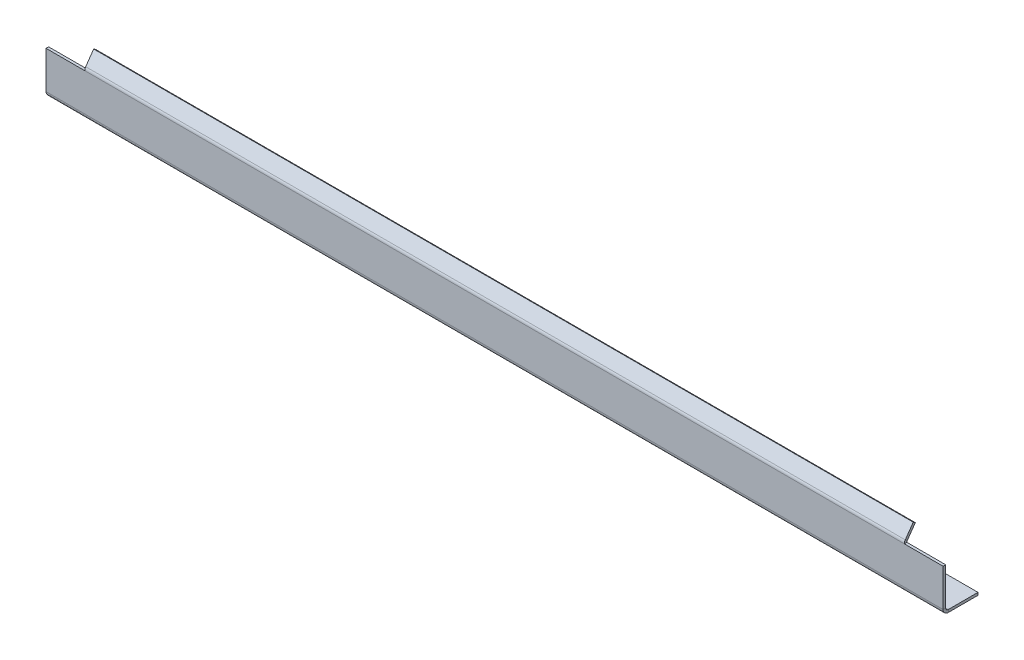
ISO-10303-21;
HEADER;
FILE_DESCRIPTION(('STEP AP214'),'2;1');
FILE_NAME('part.step','',(''),(''),'','','');
FILE_SCHEMA(('AUTOMOTIVE_DESIGN { 1 0 10303 214 1 1 1 1 }'));
ENDSEC;
DATA;
#1=APPLICATION_CONTEXT('core data for automotive mechanical design processes');
#2=APPLICATION_PROTOCOL_DEFINITION('international standard','automotive_design',2000,#1);
#3=PRODUCT_CONTEXT('',#1,'mechanical');
#4=PRODUCT('Part','Part','',(#3));
#5=PRODUCT_RELATED_PRODUCT_CATEGORY('part','',(#4));
#6=PRODUCT_DEFINITION_FORMATION('','',#4);
#7=PRODUCT_DEFINITION_CONTEXT('part definition',#1,'design');
#8=PRODUCT_DEFINITION('design','',#6,#7);
#9=PRODUCT_DEFINITION_SHAPE('','',#8);
#10=(LENGTH_UNIT() NAMED_UNIT(*) SI_UNIT(.MILLI.,.METRE.));
#11=(NAMED_UNIT(*) PLANE_ANGLE_UNIT() SI_UNIT($,.RADIAN.));
#12=(NAMED_UNIT(*) SI_UNIT($,.STERADIAN.) SOLID_ANGLE_UNIT());
#13=UNCERTAINTY_MEASURE_WITH_UNIT(LENGTH_MEASURE(1.E-05),#10,'distance_accuracy_value','');
#14=(GEOMETRIC_REPRESENTATION_CONTEXT(3) GLOBAL_UNCERTAINTY_ASSIGNED_CONTEXT((#13)) GLOBAL_UNIT_ASSIGNED_CONTEXT((#10,
#11,#12)) REPRESENTATION_CONTEXT('',''));
#15=CARTESIAN_POINT('',(0.,0.,0.));
#16=DIRECTION('',(0.,0.,1.));
#17=DIRECTION('',(1.,0.,0.));
#18=AXIS2_PLACEMENT_3D('',#15,#16,#17);
#19=CARTESIAN_POINT('',(-347.,16.5,2.));
#20=DIRECTION('',(0.,-1.,0.));
#21=DIRECTION('',(0.,0.,-1.));
#22=AXIS2_PLACEMENT_3D('',#19,#20,#21);
#23=PLANE('',#22);
#24=DIRECTION('',(0.,0.,1.));
#25=VECTOR('',#24,1.);
#26=CARTESIAN_POINT('',(-317.,16.4999999999999,0.));
#27=LINE('',#26,#25);
#28=CARTESIAN_POINT('',(-317.,16.4999999999999,0.));
#29=VERTEX_POINT('',#28);
#30=CARTESIAN_POINT('',(-317.,16.4999999999999,2.00000000000003));
#31=VERTEX_POINT('',#30);
#32=EDGE_CURVE('E241',#29,#31,#27,.T.);
#33=ORIENTED_EDGE('',*,*,#32,.F.);
#34=DIRECTION('',(-1.,0.,0.));
#35=VECTOR('',#34,1.);
#36=CARTESIAN_POINT('',(-347.,16.5,0.));
#37=LINE('',#36,#35);
#38=CARTESIAN_POINT('',(-347.,16.5,0.));
#39=VERTEX_POINT('',#38);
#40=EDGE_CURVE('E312',#29,#39,#37,.T.);
#41=ORIENTED_EDGE('',*,*,#40,.T.);
#42=DIRECTION('',(0.,0.,-1.));
#43=VECTOR('',#42,1.);
#44=CARTESIAN_POINT('',(-347.,16.5,2.));
#45=LINE('',#44,#43);
#46=CARTESIAN_POINT('',(-347.,16.5,2.));
#47=VERTEX_POINT('',#46);
#48=EDGE_CURVE('E88',#47,#39,#45,.T.);
#49=ORIENTED_EDGE('',*,*,#48,.F.);
#50=DIRECTION('',(-1.,0.,0.));
#51=VECTOR('',#50,1.);
#52=CARTESIAN_POINT('',(-347.,16.5,2.));
#53=LINE('',#52,#51);
#54=EDGE_CURVE('E302',#31,#47,#53,.T.);
#55=ORIENTED_EDGE('',*,*,#54,.F.);
#56=EDGE_LOOP('',(#33,#41,#49,#55));
#57=FACE_BOUND('',#56,.T.);
#58=ADVANCED_FACE('F80',(#57),#23,.F.);
#59=CARTESIAN_POINT('',(347.,16.5,2.));
#60=DIRECTION('',(-1.,0.,0.));
#61=DIRECTION('',(0.,0.,1.));
#62=AXIS2_PLACEMENT_3D('',#59,#60,#61);
#63=PLANE('',#62);
#64=DIRECTION('',(0.,0.,1.));
#65=VECTOR('',#64,1.);
#66=CARTESIAN_POINT('',(347.,-12.5,1.23165366794353E-13));
#67=LINE('',#66,#65);
#68=CARTESIAN_POINT('',(347.,-12.5,1.23165366794353E-13));
#69=VERTEX_POINT('',#68);
#70=CARTESIAN_POINT('',(347.,-12.5,2.));
#71=VERTEX_POINT('',#70);
#72=EDGE_CURVE('E295',#69,#71,#67,.T.);
#73=ORIENTED_EDGE('',*,*,#72,.F.);
#74=DIRECTION('',(0.,1.,0.));
#75=VECTOR('',#74,1.);
#76=CARTESIAN_POINT('',(347.,16.5,0.));
#77=LINE('',#76,#75);
#78=CARTESIAN_POINT('',(347.,16.5,0.));
#79=VERTEX_POINT('',#78);
#80=EDGE_CURVE('E297',#69,#79,#77,.T.);
#81=ORIENTED_EDGE('',*,*,#80,.T.);
#82=DIRECTION('',(0.,0.,-1.));
#83=VECTOR('',#82,1.);
#84=CARTESIAN_POINT('',(347.,16.5,2.));
#85=LINE('',#84,#83);
#86=CARTESIAN_POINT('',(347.,16.5,2.));
#87=VERTEX_POINT('',#86);
#88=EDGE_CURVE('E13',#87,#79,#85,.T.);
#89=ORIENTED_EDGE('',*,*,#88,.F.);
#90=DIRECTION('',(0.,1.,0.));
#91=VECTOR('',#90,1.);
#92=CARTESIAN_POINT('',(347.,16.5,2.));
#93=LINE('',#92,#91);
#94=EDGE_CURVE('E300',#71,#87,#93,.T.);
#95=ORIENTED_EDGE('',*,*,#94,.F.);
#96=EDGE_LOOP('',(#73,#81,#89,#95));
#97=FACE_BOUND('',#96,.T.);
#98=ADVANCED_FACE('F82',(#97),#63,.F.);
#99=CARTESIAN_POINT('',(-347.,16.5,2.));
#100=DIRECTION('',(1.,0.,0.));
#101=DIRECTION('',(0.,0.,-1.));
#102=AXIS2_PLACEMENT_3D('',#99,#100,#101);
#103=PLANE('',#102);
#104=DIRECTION('',(0.,0.,1.));
#105=VECTOR('',#104,1.);
#106=CARTESIAN_POINT('',(-347.,-12.5,1.23165366794353E-13));
#107=LINE('',#106,#105);
#108=CARTESIAN_POINT('',(-347.,-12.5,1.23165366794353E-13));
#109=VERTEX_POINT('',#108);
#110=CARTESIAN_POINT('',(-347.,-12.5,2.00000000000012));
#111=VERTEX_POINT('',#110);
#112=EDGE_CURVE('E285',#109,#111,#107,.T.);
#113=ORIENTED_EDGE('',*,*,#112,.T.);
#114=DIRECTION('',(0.,-1.,0.));
#115=VECTOR('',#114,1.);
#116=CARTESIAN_POINT('',(-347.,16.5,2.));
#117=LINE('',#116,#115);
#118=EDGE_CURVE('E307',#47,#111,#117,.T.);
#119=ORIENTED_EDGE('',*,*,#118,.F.);
#120=ORIENTED_EDGE('',*,*,#48,.T.);
#121=DIRECTION('',(0.,-1.,0.));
#122=VECTOR('',#121,1.);
#123=CARTESIAN_POINT('',(-347.,16.5,0.));
#124=LINE('',#123,#122);
#125=EDGE_CURVE('E303',#39,#109,#124,.T.);
#126=ORIENTED_EDGE('',*,*,#125,.T.);
#127=EDGE_LOOP('',(#113,#119,#120,#126));
#128=FACE_BOUND('',#127,.T.);
#129=ADVANCED_FACE('F323',(#128),#103,.F.);
#130=CARTESIAN_POINT('',(347.,-16.5,2.));
#131=DIRECTION('',(0.,0.,1.));
#132=DIRECTION('',(1.,0.,0.));
#133=AXIS2_PLACEMENT_3D('',#130,#131,#132);
#134=PLANE('',#133);
#135=ORIENTED_EDGE('',*,*,#118,.T.);
#136=DIRECTION('',(-1.,0.,0.));
#137=VECTOR('',#136,1.);
#138=CARTESIAN_POINT('',(-347.,-12.5,2.00000000000012));
#139=LINE('',#138,#137);
#140=EDGE_CURVE('E280',#111,#71,#139,.F.);
#141=ORIENTED_EDGE('',*,*,#140,.T.);
#142=ORIENTED_EDGE('',*,*,#94,.T.);
#143=CARTESIAN_POINT('',(317.,16.5,2.));
#144=VERTEX_POINT('',#143);
#145=EDGE_CURVE('E304',#87,#144,#53,.T.);
#146=ORIENTED_EDGE('',*,*,#145,.T.);
#147=DIRECTION('',(1.,0.,0.));
#148=VECTOR('',#147,1.);
#149=CARTESIAN_POINT('',(317.,16.4999999999999,2.00000000000037));
#150=LINE('',#149,#148);
#151=EDGE_CURVE('E185',#144,#31,#150,.F.);
#152=ORIENTED_EDGE('',*,*,#151,.T.);
#153=ORIENTED_EDGE('',*,*,#54,.T.);
#154=EDGE_LOOP('',(#135,#141,#142,#146,#152,#153));
#155=FACE_BOUND('',#154,.T.);
#156=ADVANCED_FACE('F362',(#155),#134,.T.);
#157=CARTESIAN_POINT('',(347.,-16.5,0.));
#158=DIRECTION('',(0.,0.,1.));
#159=DIRECTION('',(1.,0.,0.));
#160=AXIS2_PLACEMENT_3D('',#157,#158,#159);
#161=PLANE('',#160);
#162=DIRECTION('',(-1.,0.,0.));
#163=VECTOR('',#162,1.);
#164=CARTESIAN_POINT('',(-347.,-12.5,1.23165366794353E-13));
#165=LINE('',#164,#163);
#166=EDGE_CURVE('E291',#109,#69,#165,.F.);
#167=ORIENTED_EDGE('',*,*,#166,.F.);
#168=ORIENTED_EDGE('',*,*,#125,.F.);
#169=ORIENTED_EDGE('',*,*,#40,.F.);
#170=DIRECTION('',(1.,0.,0.));
#171=VECTOR('',#170,1.);
#172=CARTESIAN_POINT('',(317.,16.4999999999999,3.68195057776077E-13));
#173=LINE('',#172,#171);
#174=CARTESIAN_POINT('',(317.,16.4999999999999,3.68195057776077E-13));
#175=VERTEX_POINT('',#174);
#176=EDGE_CURVE('E238',#175,#29,#173,.F.);
#177=ORIENTED_EDGE('',*,*,#176,.F.);
#178=EDGE_CURVE('E313',#79,#175,#37,.T.);
#179=ORIENTED_EDGE('',*,*,#178,.F.);
#180=ORIENTED_EDGE('',*,*,#80,.F.);
#181=EDGE_LOOP('',(#167,#168,#169,#177,#179,#180));
#182=FACE_BOUND('',#181,.T.);
#183=ADVANCED_FACE('F329',(#182),#161,.F.);
#184=ORIENTED_EDGE('',*,*,#178,.T.);
#185=DIRECTION('',(0.,0.,1.));
#186=VECTOR('',#185,1.);
#187=CARTESIAN_POINT('',(317.,16.4999999999999,3.68195057776077E-13));
#188=LINE('',#187,#186);
#189=EDGE_CURVE('E234',#175,#144,#188,.T.);
#190=ORIENTED_EDGE('',*,*,#189,.T.);
#191=ORIENTED_EDGE('',*,*,#145,.F.);
#192=ORIENTED_EDGE('',*,*,#88,.T.);
#193=EDGE_LOOP('',(#184,#190,#191,#192));
#194=FACE_BOUND('',#193,.T.);
#195=ADVANCED_FACE('F389',(#194),#23,.F.);
#196=CARTESIAN_POINT('',(347.,-12.5,-1.99999999999988));
#197=DIRECTION('',(1.,0.,0.));
#198=DIRECTION('',(0.,0.,-1.));
#199=AXIS2_PLACEMENT_3D('',#196,#197,#198);
#200=PLANE('',#199);
#201=DIRECTION('',(0.,-1.,0.));
#202=VECTOR('',#201,1.);
#203=CARTESIAN_POINT('',(347.,-16.5,-1.99999999999987));
#204=LINE('',#203,#202);
#205=CARTESIAN_POINT('',(347.,-14.5,-1.99999999999987));
#206=VERTEX_POINT('',#205);
#207=CARTESIAN_POINT('',(347.,-16.5,-1.99999999999986));
#208=VERTEX_POINT('',#207);
#209=EDGE_CURVE('E243',#206,#208,#204,.T.);
#210=ORIENTED_EDGE('',*,*,#209,.F.);
#211=CARTESIAN_POINT('',(347.,-12.5,-1.99999999999988));
#212=DIRECTION('',(-1.,0.,0.));
#213=DIRECTION('',(0.,0.,1.));
#214=AXIS2_PLACEMENT_3D('',#211,#212,#213);
#215=CIRCLE('',#214,2.);
#216=EDGE_CURVE('E288',#69,#206,#215,.F.);
#217=ORIENTED_EDGE('',*,*,#216,.F.);
#218=ORIENTED_EDGE('',*,*,#72,.T.);
#219=CARTESIAN_POINT('',(347.,-12.5,-1.99999999999988));
#220=DIRECTION('',(-1.,0.,0.));
#221=DIRECTION('',(0.,0.,1.));
#222=AXIS2_PLACEMENT_3D('',#219,#220,#221);
#223=CIRCLE('',#222,4.);
#224=EDGE_CURVE('E103',#71,#208,#223,.F.);
#225=ORIENTED_EDGE('',*,*,#224,.T.);
#226=EDGE_LOOP('',(#210,#217,#218,#225));
#227=FACE_BOUND('',#226,.T.);
#228=ADVANCED_FACE('F340',(#227),#200,.T.);
#229=CARTESIAN_POINT('',(-347.,-12.5,-1.99999999999988));
#230=DIRECTION('',(1.,0.,0.));
#231=DIRECTION('',(0.,0.,-1.));
#232=AXIS2_PLACEMENT_3D('',#229,#230,#231);
#233=PLANE('',#232);
#234=CARTESIAN_POINT('',(-347.,-12.5,-1.99999999999988));
#235=DIRECTION('',(-1.,0.,0.));
#236=DIRECTION('',(0.,0.,1.));
#237=AXIS2_PLACEMENT_3D('',#234,#235,#236);
#238=CIRCLE('',#237,2.);
#239=CARTESIAN_POINT('',(-347.,-14.5,-1.99999999999987));
#240=VERTEX_POINT('',#239);
#241=EDGE_CURVE('E247',#240,#109,#238,.T.);
#242=ORIENTED_EDGE('',*,*,#241,.F.);
#243=DIRECTION('',(0.,-1.,0.));
#244=VECTOR('',#243,1.);
#245=CARTESIAN_POINT('',(-347.,-14.5,-1.99999999999986));
#246=LINE('',#245,#244);
#247=CARTESIAN_POINT('',(-347.,-16.5,-1.99999999999985));
#248=VERTEX_POINT('',#247);
#249=EDGE_CURVE('E273',#240,#248,#246,.T.);
#250=ORIENTED_EDGE('',*,*,#249,.T.);
#251=CARTESIAN_POINT('',(-347.,-12.5,-1.99999999999988));
#252=DIRECTION('',(-1.,0.,0.));
#253=DIRECTION('',(0.,0.,1.));
#254=AXIS2_PLACEMENT_3D('',#251,#252,#253);
#255=CIRCLE('',#254,4.);
#256=EDGE_CURVE('E283',#248,#111,#255,.T.);
#257=ORIENTED_EDGE('',*,*,#256,.T.);
#258=ORIENTED_EDGE('',*,*,#112,.F.);
#259=EDGE_LOOP('',(#242,#250,#257,#258));
#260=FACE_BOUND('',#259,.T.);
#261=ADVANCED_FACE('F360',(#260),#233,.F.);
#262=CARTESIAN_POINT('',(-347.,-12.5,-1.99999999999988));
#263=DIRECTION('',(-1.,0.,0.));
#264=DIRECTION('',(0.,-1.,0.));
#265=AXIS2_PLACEMENT_3D('',#262,#263,#264);
#266=CYLINDRICAL_SURFACE('',#265,4.);
#267=ORIENTED_EDGE('',*,*,#140,.F.);
#268=ORIENTED_EDGE('',*,*,#256,.F.);
#269=DIRECTION('',(-1.,0.,0.));
#270=VECTOR('',#269,1.);
#271=CARTESIAN_POINT('',(-347.,-16.5,-1.99999999999985));
#272=LINE('',#271,#270);
#273=EDGE_CURVE('E270',#208,#248,#272,.T.);
#274=ORIENTED_EDGE('',*,*,#273,.F.);
#275=ORIENTED_EDGE('',*,*,#224,.F.);
#276=EDGE_LOOP('',(#267,#268,#274,#275));
#277=FACE_BOUND('',#276,.T.);
#278=ADVANCED_FACE('F574',(#277),#266,.T.);
#279=CARTESIAN_POINT('',(-347.,-12.5,-1.99999999999988));
#280=DIRECTION('',(-1.,0.,0.));
#281=DIRECTION('',(0.,-1.,0.));
#282=AXIS2_PLACEMENT_3D('',#279,#280,#281);
#283=CYLINDRICAL_SURFACE('',#282,2.);
#284=ORIENTED_EDGE('',*,*,#166,.T.);
#285=ORIENTED_EDGE('',*,*,#216,.T.);
#286=DIRECTION('',(1.,0.,0.));
#287=VECTOR('',#286,1.);
#288=CARTESIAN_POINT('',(347.,-14.5,-1.99999999999988));
#289=LINE('',#288,#287);
#290=EDGE_CURVE('E276',#206,#240,#289,.F.);
#291=ORIENTED_EDGE('',*,*,#290,.T.);
#292=ORIENTED_EDGE('',*,*,#241,.T.);
#293=EDGE_LOOP('',(#284,#285,#291,#292));
#294=FACE_BOUND('',#293,.T.);
#295=ADVANCED_FACE('F336',(#294),#283,.F.);
#296=CARTESIAN_POINT('',(-347.,-16.5,1.2220184685951E-13));
#297=DIRECTION('',(-1.,0.,0.));
#298=DIRECTION('',(0.,0.,1.));
#299=AXIS2_PLACEMENT_3D('',#296,#297,#298);
#300=PLANE('',#299);
#301=DIRECTION('',(0.,0.,1.));
#302=VECTOR('',#301,1.);
#303=CARTESIAN_POINT('',(-347.,-16.5,1.2220184685951E-13));
#304=LINE('',#303,#302);
#305=CARTESIAN_POINT('',(-347.,-16.5000000000001,-25.));
#306=VERTEX_POINT('',#305);
#307=EDGE_CURVE('E251',#306,#248,#304,.T.);
#308=ORIENTED_EDGE('',*,*,#307,.T.);
#309=ORIENTED_EDGE('',*,*,#249,.F.);
#310=DIRECTION('',(0.,0.,-1.));
#311=VECTOR('',#310,1.);
#312=CARTESIAN_POINT('',(-347.,-14.5,1.15218884181823E-13));
#313=LINE('',#312,#311);
#314=CARTESIAN_POINT('',(-347.,-14.5000000000001,-25.));
#315=VERTEX_POINT('',#314);
#316=EDGE_CURVE('E260',#315,#240,#313,.F.);
#317=ORIENTED_EDGE('',*,*,#316,.F.);
#318=DIRECTION('',(0.,1.,0.));
#319=VECTOR('',#318,1.);
#320=CARTESIAN_POINT('',(-347.,-16.5000000000001,-25.));
#321=LINE('',#320,#319);
#322=EDGE_CURVE('E245',#306,#315,#321,.T.);
#323=ORIENTED_EDGE('',*,*,#322,.F.);
#324=EDGE_LOOP('',(#308,#309,#317,#323));
#325=FACE_BOUND('',#324,.T.);
#326=ADVANCED_FACE('F358',(#325),#300,.T.);
#327=CARTESIAN_POINT('',(347.,-16.5000000000001,-25.));
#328=DIRECTION('',(1.,0.,0.));
#329=DIRECTION('',(0.,0.,-1.));
#330=AXIS2_PLACEMENT_3D('',#327,#328,#329);
#331=PLANE('',#330);
#332=DIRECTION('',(0.,0.,1.));
#333=VECTOR('',#332,1.);
#334=CARTESIAN_POINT('',(347.,-14.5,1.15218884181823E-13));
#335=LINE('',#334,#333);
#336=CARTESIAN_POINT('',(347.,-14.5000000000001,-25.));
#337=VERTEX_POINT('',#336);
#338=EDGE_CURVE('E268',#206,#337,#335,.F.);
#339=ORIENTED_EDGE('',*,*,#338,.F.);
#340=ORIENTED_EDGE('',*,*,#209,.T.);
#341=DIRECTION('',(0.,0.,-1.));
#342=VECTOR('',#341,1.);
#343=CARTESIAN_POINT('',(347.,-16.5000000000001,-25.));
#344=LINE('',#343,#342);
#345=CARTESIAN_POINT('',(347.,-16.5000000000001,-25.));
#346=VERTEX_POINT('',#345);
#347=EDGE_CURVE('E258',#208,#346,#344,.T.);
#348=ORIENTED_EDGE('',*,*,#347,.T.);
#349=DIRECTION('',(0.,1.,0.));
#350=VECTOR('',#349,1.);
#351=CARTESIAN_POINT('',(347.,-16.5000000000001,-25.));
#352=LINE('',#351,#350);
#353=EDGE_CURVE('E248',#346,#337,#352,.T.);
#354=ORIENTED_EDGE('',*,*,#353,.T.);
#355=EDGE_LOOP('',(#339,#340,#348,#354));
#356=FACE_BOUND('',#355,.T.);
#357=ADVANCED_FACE('F344',(#356),#331,.T.);
#358=CARTESIAN_POINT('',(-347.,-16.5,1.2220184685951E-13));
#359=DIRECTION('',(0.,-1.,0.));
#360=DIRECTION('',(0.,0.,-1.));
#361=AXIS2_PLACEMENT_3D('',#358,#359,#360);
#362=PLANE('',#361);
#363=ORIENTED_EDGE('',*,*,#347,.F.);
#364=ORIENTED_EDGE('',*,*,#273,.T.);
#365=ORIENTED_EDGE('',*,*,#307,.F.);
#366=DIRECTION('',(-1.,0.,0.));
#367=VECTOR('',#366,1.);
#368=CARTESIAN_POINT('',(-347.,-16.5000000000001,-25.));
#369=LINE('',#368,#367);
#370=EDGE_CURVE('E255',#346,#306,#369,.T.);
#371=ORIENTED_EDGE('',*,*,#370,.F.);
#372=EDGE_LOOP('',(#363,#364,#365,#371));
#373=FACE_BOUND('',#372,.T.);
#374=ADVANCED_FACE('F348',(#373),#362,.T.);
#375=CARTESIAN_POINT('',(-347.,-14.5,1.15218884181823E-13));
#376=DIRECTION('',(0.,-1.,0.));
#377=DIRECTION('',(0.,0.,-1.));
#378=AXIS2_PLACEMENT_3D('',#375,#376,#377);
#379=PLANE('',#378);
#380=ORIENTED_EDGE('',*,*,#290,.F.);
#381=ORIENTED_EDGE('',*,*,#338,.T.);
#382=DIRECTION('',(1.,0.,0.));
#383=VECTOR('',#382,1.);
#384=CARTESIAN_POINT('',(-347.,-14.5000000000001,-25.));
#385=LINE('',#384,#383);
#386=EDGE_CURVE('E264',#337,#315,#385,.F.);
#387=ORIENTED_EDGE('',*,*,#386,.T.);
#388=ORIENTED_EDGE('',*,*,#316,.T.);
#389=EDGE_LOOP('',(#380,#381,#387,#388));
#390=FACE_BOUND('',#389,.T.);
#391=ADVANCED_FACE('F355',(#390),#379,.F.);
#392=CARTESIAN_POINT('',(-347.,-16.5000000000001,-25.));
#393=DIRECTION('',(0.,0.,-1.));
#394=DIRECTION('',(0.,1.,0.));
#395=AXIS2_PLACEMENT_3D('',#392,#393,#394);
#396=PLANE('',#395);
#397=ORIENTED_EDGE('',*,*,#386,.F.);
#398=ORIENTED_EDGE('',*,*,#353,.F.);
#399=ORIENTED_EDGE('',*,*,#370,.T.);
#400=ORIENTED_EDGE('',*,*,#322,.T.);
#401=EDGE_LOOP('',(#397,#398,#399,#400));
#402=FACE_BOUND('',#401,.T.);
#403=ADVANCED_FACE('F352',(#402),#396,.T.);
#404=CARTESIAN_POINT('',(-317.,16.4999999999999,-2.00000000000006));
#405=DIRECTION('',(-1.,0.,0.));
#406=DIRECTION('',(0.,0.,1.));
#407=AXIS2_PLACEMENT_3D('',#404,#405,#406);
#408=PLANE('',#407);
#409=DIRECTION('',(0.,0.573576436351042,0.819152044288995));
#410=VECTOR('',#409,1.);
#411=CARTESIAN_POINT('',(-317.,18.7943057454041,1.27660817715601));
#412=LINE('',#411,#410);
#413=CARTESIAN_POINT('',(-317.,17.6471528727021,-0.361695911421996));
#414=VERTEX_POINT('',#413);
#415=CARTESIAN_POINT('',(-317.,18.7943057454042,1.27660817715599));
#416=VERTEX_POINT('',#415);
#417=EDGE_CURVE('E229',#414,#416,#412,.T.);
#418=ORIENTED_EDGE('',*,*,#417,.F.);
#419=CARTESIAN_POINT('',(-317.,16.4999999999999,-2.00000000000006));
#420=DIRECTION('',(1.,0.,0.));
#421=DIRECTION('',(0.,0.,-1.));
#422=AXIS2_PLACEMENT_3D('',#419,#420,#421);
#423=CIRCLE('',#422,2.0000000000001);
#424=EDGE_CURVE('E187',#29,#414,#423,.F.);
#425=ORIENTED_EDGE('',*,*,#424,.F.);
#426=ORIENTED_EDGE('',*,*,#32,.T.);
#427=CARTESIAN_POINT('',(-317.,16.4999999999999,-2.00000000000006));
#428=DIRECTION('',(1.,0.,0.));
#429=DIRECTION('',(0.,0.,-1.));
#430=AXIS2_PLACEMENT_3D('',#427,#428,#429);
#431=CIRCLE('',#430,4.0000000000001);
#432=EDGE_CURVE('E233',#31,#416,#431,.F.);
#433=ORIENTED_EDGE('',*,*,#432,.T.);
#434=EDGE_LOOP('',(#418,#425,#426,#433));
#435=FACE_BOUND('',#434,.T.);
#436=ADVANCED_FACE('F367',(#435),#408,.T.);
#437=CARTESIAN_POINT('',(317.,16.4999999999999,-1.99999999999973));
#438=DIRECTION('',(-1.,0.,0.));
#439=DIRECTION('',(0.,0.,1.));
#440=AXIS2_PLACEMENT_3D('',#437,#438,#439);
#441=PLANE('',#440);
#442=CARTESIAN_POINT('',(317.,16.4999999999999,-1.99999999999973));
#443=DIRECTION('',(1.,0.,0.));
#444=DIRECTION('',(0.,0.,-1.));
#445=AXIS2_PLACEMENT_3D('',#442,#443,#444);
#446=CIRCLE('',#445,2.0000000000001);
#447=CARTESIAN_POINT('',(317.,17.6471528727021,-0.361695911421659));
#448=VERTEX_POINT('',#447);
#449=EDGE_CURVE('E194',#448,#175,#446,.T.);
#450=ORIENTED_EDGE('',*,*,#449,.F.);
#451=DIRECTION('',(0.,0.573576436351042,0.819152044288995));
#452=VECTOR('',#451,1.);
#453=CARTESIAN_POINT('',(317.,17.6471528727019,-0.361695911421899));
#454=LINE('',#453,#452);
#455=CARTESIAN_POINT('',(317.,18.794305745404,1.27660817715609));
#456=VERTEX_POINT('',#455);
#457=EDGE_CURVE('E191',#448,#456,#454,.T.);
#458=ORIENTED_EDGE('',*,*,#457,.T.);
#459=CARTESIAN_POINT('',(317.,16.4999999999999,-1.99999999999973));
#460=DIRECTION('',(1.,0.,0.));
#461=DIRECTION('',(0.,0.,-1.));
#462=AXIS2_PLACEMENT_3D('',#459,#460,#461);
#463=CIRCLE('',#462,4.0000000000001);
#464=EDGE_CURVE('E95',#456,#144,#463,.T.);
#465=ORIENTED_EDGE('',*,*,#464,.T.);
#466=ORIENTED_EDGE('',*,*,#189,.F.);
#467=EDGE_LOOP('',(#450,#458,#465,#466));
#468=FACE_BOUND('',#467,.T.);
#469=ADVANCED_FACE('F192',(#468),#441,.F.);
#470=CARTESIAN_POINT('',(317.,16.4999999999999,-1.99999999999973));
#471=DIRECTION('',(1.,0.,0.));
#472=DIRECTION('',(0.,0.573576436351042,0.819152044288995));
#473=AXIS2_PLACEMENT_3D('',#470,#471,#472);
#474=CYLINDRICAL_SURFACE('',#473,4.0000000000001);
#475=ORIENTED_EDGE('',*,*,#151,.F.);
#476=ORIENTED_EDGE('',*,*,#464,.F.);
#477=DIRECTION('',(1.,0.,0.));
#478=VECTOR('',#477,1.);
#479=CARTESIAN_POINT('',(0.,18.7943057454041,1.27660817715605));
#480=LINE('',#479,#478);
#481=EDGE_CURVE('E182',#416,#456,#480,.T.);
#482=ORIENTED_EDGE('',*,*,#481,.F.);
#483=ORIENTED_EDGE('',*,*,#432,.F.);
#484=EDGE_LOOP('',(#475,#476,#482,#483));
#485=FACE_BOUND('',#484,.T.);
#486=ADVANCED_FACE('F179',(#485),#474,.T.);
#487=CARTESIAN_POINT('',(317.,16.4999999999999,-1.99999999999973));
#488=DIRECTION('',(1.,0.,0.));
#489=DIRECTION('',(0.,0.573576436351042,0.819152044288995));
#490=AXIS2_PLACEMENT_3D('',#487,#488,#489);
#491=CYLINDRICAL_SURFACE('',#490,2.0000000000001);
#492=ORIENTED_EDGE('',*,*,#176,.T.);
#493=ORIENTED_EDGE('',*,*,#424,.T.);
#494=DIRECTION('',(-1.,0.,0.));
#495=VECTOR('',#494,1.);
#496=CARTESIAN_POINT('',(-317.,17.647152872702,-0.361695911421982));
#497=LINE('',#496,#495);
#498=EDGE_CURVE('E199',#414,#448,#497,.F.);
#499=ORIENTED_EDGE('',*,*,#498,.T.);
#500=ORIENTED_EDGE('',*,*,#449,.T.);
#501=EDGE_LOOP('',(#492,#493,#499,#500));
#502=FACE_BOUND('',#501,.T.);
#503=ADVANCED_FACE('F370',(#502),#491,.F.);
#504=CARTESIAN_POINT('',(317.,18.2777504504599,1.63830408857806));
#505=DIRECTION('',(1.,0.,0.));
#506=DIRECTION('',(0.,0.,-1.));
#507=AXIS2_PLACEMENT_3D('',#504,#505,#506);
#508=PLANE('',#507);
#509=DIRECTION('',(0.,-0.819152044288995,0.573576436351042));
#510=VECTOR('',#509,1.);
#511=CARTESIAN_POINT('',(317.,18.2777504504599,1.63830408857806));
#512=LINE('',#511,#510);
#513=CARTESIAN_POINT('',(317.,27.5910196869839,-4.8829172362125));
#514=VERTEX_POINT('',#513);
#515=EDGE_CURVE('E206',#514,#456,#512,.T.);
#516=ORIENTED_EDGE('',*,*,#515,.T.);
#517=ORIENTED_EDGE('',*,*,#457,.F.);
#518=DIRECTION('',(0.,0.819152044288995,-0.573576436351042));
#519=VECTOR('',#518,1.);
#520=CARTESIAN_POINT('',(317.,6.05893139532111,7.75246412148371));
#521=LINE('',#520,#519);
#522=CARTESIAN_POINT('',(317.,26.4438668142818,-6.52122132479048));
#523=VERTEX_POINT('',#522);
#524=EDGE_CURVE('E222',#523,#448,#521,.F.);
#525=ORIENTED_EDGE('',*,*,#524,.F.);
#526=DIRECTION('',(0.,-0.573576436351042,-0.819152044288995));
#527=VECTOR('',#526,1.);
#528=CARTESIAN_POINT('',(317.,27.5910196869839,-4.8829172362125));
#529=LINE('',#528,#527);
#530=EDGE_CURVE('E211',#514,#523,#529,.T.);
#531=ORIENTED_EDGE('',*,*,#530,.F.);
#532=EDGE_LOOP('',(#516,#517,#525,#531));
#533=FACE_BOUND('',#532,.T.);
#534=ADVANCED_FACE('F210',(#533),#508,.T.);
#535=CARTESIAN_POINT('',(-317.,27.5910196869839,-4.88291723621254));
#536=DIRECTION('',(-1.,0.,0.));
#537=DIRECTION('',(0.,0.,1.));
#538=AXIS2_PLACEMENT_3D('',#535,#536,#537);
#539=PLANE('',#538);
#540=DIRECTION('',(0.,-0.819152044288995,0.573576436351042));
#541=VECTOR('',#540,1.);
#542=CARTESIAN_POINT('',(-317.,6.05893139532111,7.75246412148372));
#543=LINE('',#542,#541);
#544=CARTESIAN_POINT('',(-317.,26.4438668142818,-6.52122132479053));
#545=VERTEX_POINT('',#544);
#546=EDGE_CURVE('E208',#414,#545,#543,.F.);
#547=ORIENTED_EDGE('',*,*,#546,.F.);
#548=ORIENTED_EDGE('',*,*,#417,.T.);
#549=DIRECTION('',(0.,0.819152044288995,-0.573576436351042));
#550=VECTOR('',#549,1.);
#551=CARTESIAN_POINT('',(-317.,27.5910196869839,-4.88291723621254));
#552=LINE('',#551,#550);
#553=CARTESIAN_POINT('',(-317.,27.5910196869839,-4.88291723621254));
#554=VERTEX_POINT('',#553);
#555=EDGE_CURVE('E207',#416,#554,#552,.T.);
#556=ORIENTED_EDGE('',*,*,#555,.T.);
#557=DIRECTION('',(0.,-0.573576436351042,-0.819152044288995));
#558=VECTOR('',#557,1.);
#559=CARTESIAN_POINT('',(-317.,27.5910196869839,-4.88291723621254));
#560=LINE('',#559,#558);
#561=EDGE_CURVE('E213',#554,#545,#560,.T.);
#562=ORIENTED_EDGE('',*,*,#561,.T.);
#563=EDGE_LOOP('',(#547,#548,#556,#562));
#564=FACE_BOUND('',#563,.T.);
#565=ADVANCED_FACE('F375',(#564),#539,.T.);
#566=CARTESIAN_POINT('',(0.,7.20608426802319,9.3907682100617));
#567=DIRECTION('',(0.,0.573576436351042,0.819152044288995));
#568=DIRECTION('',(0.,-0.819152044288995,0.573576436351042));
#569=AXIS2_PLACEMENT_3D('',#566,#567,#568);
#570=PLANE('',#569);
#571=ORIENTED_EDGE('',*,*,#555,.F.);
#572=ORIENTED_EDGE('',*,*,#481,.T.);
#573=ORIENTED_EDGE('',*,*,#515,.F.);
#574=DIRECTION('',(1.,0.,0.));
#575=VECTOR('',#574,1.);
#576=CARTESIAN_POINT('',(317.,27.5910196869839,-4.8829172362125));
#577=LINE('',#576,#575);
#578=EDGE_CURVE('E214',#554,#514,#577,.T.);
#579=ORIENTED_EDGE('',*,*,#578,.F.);
#580=EDGE_LOOP('',(#571,#572,#573,#579));
#581=FACE_BOUND('',#580,.T.);
#582=ADVANCED_FACE('F204',(#581),#570,.T.);
#583=CARTESIAN_POINT('',(0.,6.05893139532111,7.75246412148372));
#584=DIRECTION('',(0.,0.573576436351042,0.819152044288995));
#585=DIRECTION('',(0.,-0.819152044288995,0.573576436351042));
#586=AXIS2_PLACEMENT_3D('',#583,#584,#585);
#587=PLANE('',#586);
#588=ORIENTED_EDGE('',*,*,#498,.F.);
#589=ORIENTED_EDGE('',*,*,#546,.T.);
#590=DIRECTION('',(-1.,0.,0.));
#591=VECTOR('',#590,1.);
#592=CARTESIAN_POINT('',(0.,26.4438668142818,-6.52122132479051));
#593=LINE('',#592,#591);
#594=EDGE_CURVE('E224',#545,#523,#593,.F.);
#595=ORIENTED_EDGE('',*,*,#594,.T.);
#596=ORIENTED_EDGE('',*,*,#524,.T.);
#597=EDGE_LOOP('',(#588,#589,#595,#596));
#598=FACE_BOUND('',#597,.T.);
#599=ADVANCED_FACE('F373',(#598),#587,.F.);
#600=CARTESIAN_POINT('',(317.,27.5910196869839,-4.8829172362125));
#601=DIRECTION('',(0.,0.819152044288995,-0.573576436351042));
#602=DIRECTION('',(0.,0.573576436351042,0.819152044288995));
#603=AXIS2_PLACEMENT_3D('',#600,#601,#602);
#604=PLANE('',#603);
#605=ORIENTED_EDGE('',*,*,#594,.F.);
#606=ORIENTED_EDGE('',*,*,#561,.F.);
#607=ORIENTED_EDGE('',*,*,#578,.T.);
#608=ORIENTED_EDGE('',*,*,#530,.T.);
#609=EDGE_LOOP('',(#605,#606,#607,#608));
#610=FACE_BOUND('',#609,.T.);
#611=ADVANCED_FACE('F379',(#610),#604,.T.);
#612=CLOSED_SHELL('',(#58,#98,#129,#156,#183,#195,#228,#261,#278,#295,#326,#357,#374,#391,#403,
#436,#469,#486,#503,#534,#565,#582,#599,#611));
#613=MANIFOLD_SOLID_BREP('B2',#612);
#614=ADVANCED_BREP_SHAPE_REPRESENTATION('',(#18,#613),#14);
#615=SHAPE_DEFINITION_REPRESENTATION(#9,#614);
ENDSEC;
END-ISO-10303-21;
